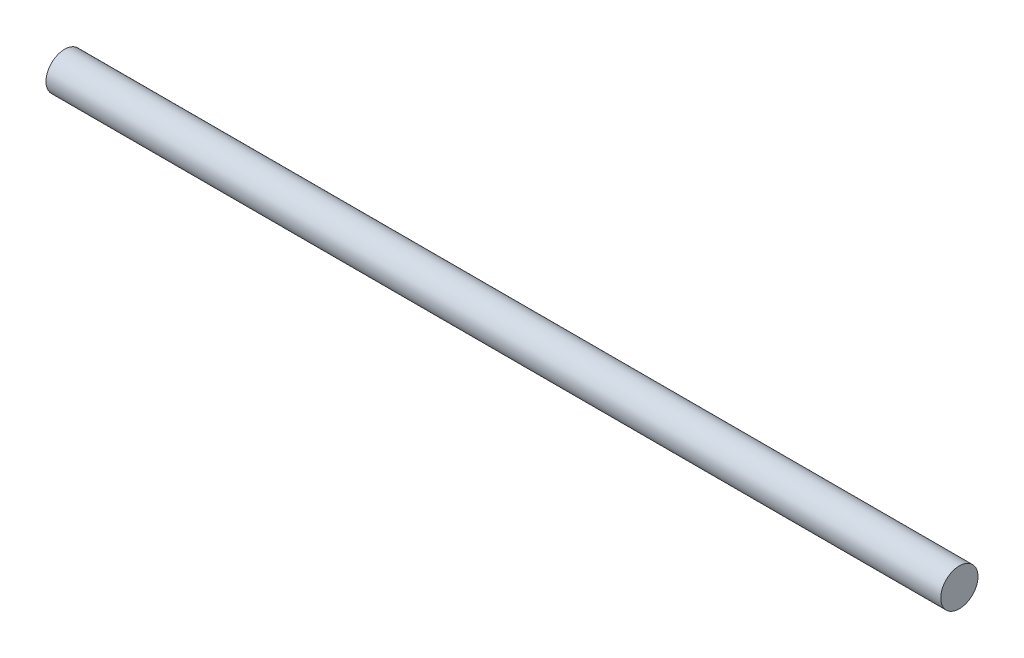
ISO-10303-21;
HEADER;
FILE_DESCRIPTION(('STEP AP214'),'2;1');
FILE_NAME('part.step','',(''),(''),'','','');
FILE_SCHEMA(('AUTOMOTIVE_DESIGN { 1 0 10303 214 1 1 1 1 }'));
ENDSEC;
DATA;
#1=APPLICATION_CONTEXT('core data for automotive mechanical design processes');
#2=APPLICATION_PROTOCOL_DEFINITION('international standard','automotive_design',2000,#1);
#3=PRODUCT_CONTEXT('',#1,'mechanical');
#4=PRODUCT('Part','Part','',(#3));
#5=PRODUCT_RELATED_PRODUCT_CATEGORY('part','',(#4));
#6=PRODUCT_DEFINITION_FORMATION('','',#4);
#7=PRODUCT_DEFINITION_CONTEXT('part definition',#1,'design');
#8=PRODUCT_DEFINITION('design','',#6,#7);
#9=PRODUCT_DEFINITION_SHAPE('','',#8);
#10=(LENGTH_UNIT() NAMED_UNIT(*) SI_UNIT(.MILLI.,.METRE.));
#11=(NAMED_UNIT(*) PLANE_ANGLE_UNIT() SI_UNIT($,.RADIAN.));
#12=(NAMED_UNIT(*) SI_UNIT($,.STERADIAN.) SOLID_ANGLE_UNIT());
#13=UNCERTAINTY_MEASURE_WITH_UNIT(LENGTH_MEASURE(1.E-05),#10,'distance_accuracy_value','');
#14=(GEOMETRIC_REPRESENTATION_CONTEXT(3) GLOBAL_UNCERTAINTY_ASSIGNED_CONTEXT((#13)) GLOBAL_UNIT_ASSIGNED_CONTEXT((#10,
#11,#12)) REPRESENTATION_CONTEXT('',''));
#15=CARTESIAN_POINT('',(0.,0.,0.));
#16=DIRECTION('',(0.,0.,1.));
#17=DIRECTION('',(1.,0.,0.));
#18=AXIS2_PLACEMENT_3D('',#15,#16,#17);
#19=CARTESIAN_POINT('',(120.,0.,0.));
#20=DIRECTION('',(-1.,0.,0.));
#21=DIRECTION('',(0.,0.,1.));
#22=AXIS2_PLACEMENT_3D('',#19,#20,#21);
#23=CYLINDRICAL_SURFACE('',#22,2.5);
#24=CARTESIAN_POINT('',(120.,0.,0.));
#25=DIRECTION('',(1.,0.,0.));
#26=DIRECTION('',(0.,0.,-1.));
#27=AXIS2_PLACEMENT_3D('',#24,#25,#26);
#28=CIRCLE('',#27,2.5);
#29=CARTESIAN_POINT('',(120.,0.,-2.5));
#30=VERTEX_POINT('',#29);
#31=EDGE_CURVE('E10',#30,#30,#28,.T.);
#32=ORIENTED_EDGE('',*,*,#31,.F.);
#33=EDGE_LOOP('',(#32));
#34=FACE_BOUND('',#33,.T.);
#35=CARTESIAN_POINT('',(0.,0.,0.));
#36=DIRECTION('',(1.,0.,0.));
#37=DIRECTION('',(0.,0.,-1.));
#38=AXIS2_PLACEMENT_3D('',#35,#36,#37);
#39=CIRCLE('',#38,2.5);
#40=CARTESIAN_POINT('',(0.,0.,-2.5));
#41=VERTEX_POINT('',#40);
#42=EDGE_CURVE('E46',#41,#41,#39,.T.);
#43=ORIENTED_EDGE('',*,*,#42,.T.);
#44=EDGE_LOOP('',(#43));
#45=FACE_BOUND('',#44,.T.);
#46=ADVANCED_FACE('F43',(#34,#45),#23,.T.);
#47=CARTESIAN_POINT('',(120.,0.,0.));
#48=DIRECTION('',(1.,0.,0.));
#49=DIRECTION('',(0.,0.,-1.));
#50=AXIS2_PLACEMENT_3D('',#47,#48,#49);
#51=PLANE('',#50);
#52=ORIENTED_EDGE('',*,*,#31,.T.);
#53=EDGE_LOOP('',(#52));
#54=FACE_BOUND('',#53,.T.);
#55=ADVANCED_FACE('F60',(#54),#51,.T.);
#56=CARTESIAN_POINT('',(0.,0.,0.));
#57=DIRECTION('',(1.,0.,0.));
#58=DIRECTION('',(0.,0.,-1.));
#59=AXIS2_PLACEMENT_3D('',#56,#57,#58);
#60=PLANE('',#59);
#61=ORIENTED_EDGE('',*,*,#42,.F.);
#62=EDGE_LOOP('',(#61));
#63=FACE_BOUND('',#62,.T.);
#64=ADVANCED_FACE('F58',(#63),#60,.F.);
#65=CLOSED_SHELL('',(#46,#55,#64));
#66=MANIFOLD_SOLID_BREP('B2',#65);
#67=ADVANCED_BREP_SHAPE_REPRESENTATION('',(#18,#66),#14);
#68=SHAPE_DEFINITION_REPRESENTATION(#9,#67);
ENDSEC;
END-ISO-10303-21;
